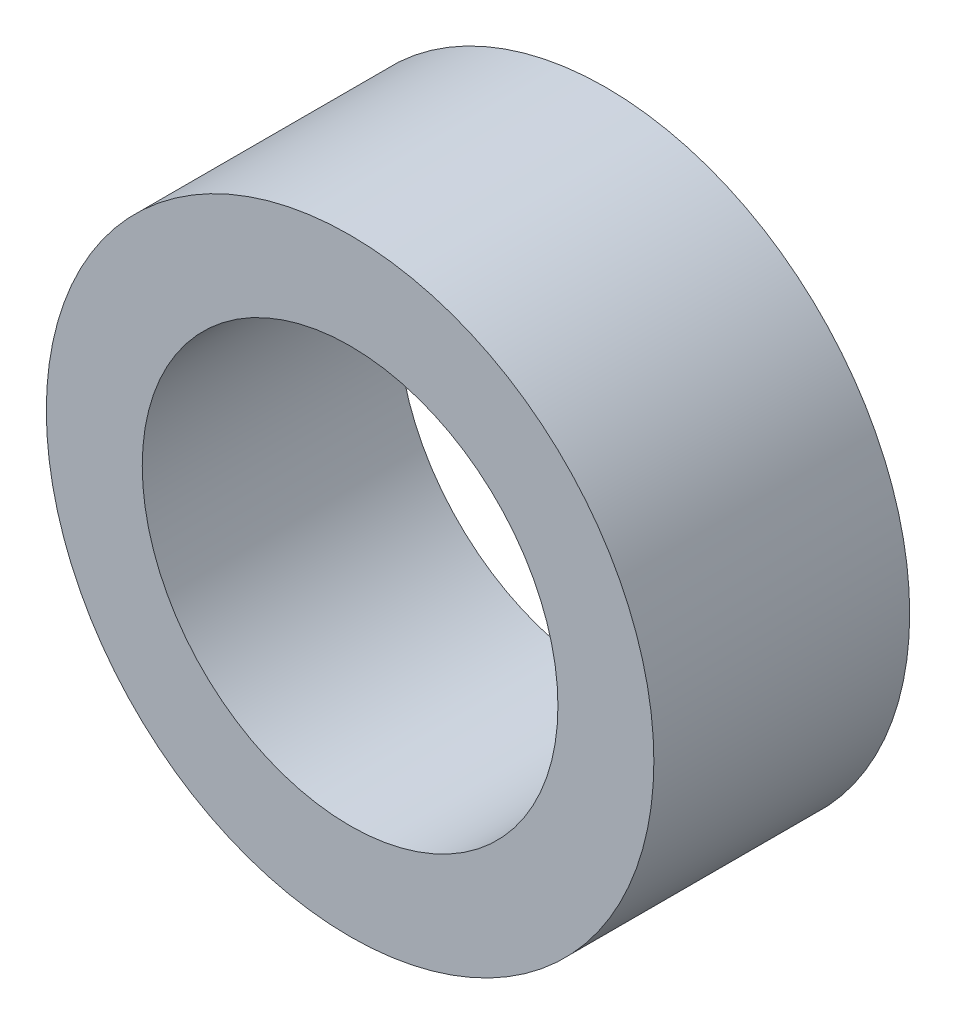
ISO-10303-21;
HEADER;
FILE_DESCRIPTION(('STEP AP214'),'2;1');
FILE_NAME('part.step','',(''),(''),'','','');
FILE_SCHEMA(('AUTOMOTIVE_DESIGN { 1 0 10303 214 1 1 1 1 }'));
ENDSEC;
DATA;
#1=APPLICATION_CONTEXT('core data for automotive mechanical design processes');
#2=APPLICATION_PROTOCOL_DEFINITION('international standard','automotive_design',2000,#1);
#3=PRODUCT_CONTEXT('',#1,'mechanical');
#4=PRODUCT('Part','Part','',(#3));
#5=PRODUCT_RELATED_PRODUCT_CATEGORY('part','',(#4));
#6=PRODUCT_DEFINITION_FORMATION('','',#4);
#7=PRODUCT_DEFINITION_CONTEXT('part definition',#1,'design');
#8=PRODUCT_DEFINITION('design','',#6,#7);
#9=PRODUCT_DEFINITION_SHAPE('','',#8);
#10=(LENGTH_UNIT() NAMED_UNIT(*) SI_UNIT(.MILLI.,.METRE.));
#11=(NAMED_UNIT(*) PLANE_ANGLE_UNIT() SI_UNIT($,.RADIAN.));
#12=(NAMED_UNIT(*) SI_UNIT($,.STERADIAN.) SOLID_ANGLE_UNIT());
#13=UNCERTAINTY_MEASURE_WITH_UNIT(LENGTH_MEASURE(1.E-05),#10,'distance_accuracy_value','');
#14=(GEOMETRIC_REPRESENTATION_CONTEXT(3) GLOBAL_UNCERTAINTY_ASSIGNED_CONTEXT((#13)) GLOBAL_UNIT_ASSIGNED_CONTEXT((#10,
#11,#12)) REPRESENTATION_CONTEXT('',''));
#15=CARTESIAN_POINT('',(0.,0.,0.));
#16=DIRECTION('',(0.,0.,1.));
#17=DIRECTION('',(1.,0.,0.));
#18=AXIS2_PLACEMENT_3D('',#15,#16,#17);
#19=CARTESIAN_POINT('',(0.,0.,4.));
#20=DIRECTION('',(0.,0.,1.));
#21=DIRECTION('',(1.,0.,0.));
#22=AXIS2_PLACEMENT_3D('',#19,#20,#21);
#23=PLANE('',#22);
#24=CARTESIAN_POINT('',(0.,0.,4.));
#25=DIRECTION('',(0.,0.,1.));
#26=DIRECTION('',(1.,0.,0.));
#27=AXIS2_PLACEMENT_3D('',#24,#25,#26);
#28=CIRCLE('',#27,4.75);
#29=CARTESIAN_POINT('',(4.75,0.,4.));
#30=VERTEX_POINT('',#29);
#31=EDGE_CURVE('E10',#30,#30,#28,.T.);
#32=ORIENTED_EDGE('',*,*,#31,.T.);
#33=EDGE_LOOP('',(#32));
#34=FACE_BOUND('',#33,.T.);
#35=CARTESIAN_POINT('',(0.,0.,4.));
#36=DIRECTION('',(0.,0.,1.));
#37=DIRECTION('',(1.,0.,0.));
#38=AXIS2_PLACEMENT_3D('',#35,#36,#37);
#39=CIRCLE('',#38,3.25);
#40=CARTESIAN_POINT('',(3.25,0.,4.));
#41=VERTEX_POINT('',#40);
#42=EDGE_CURVE('E50',#41,#41,#39,.T.);
#43=ORIENTED_EDGE('',*,*,#42,.F.);
#44=EDGE_LOOP('',(#43));
#45=FACE_BOUND('',#44,.T.);
#46=ADVANCED_FACE('F37',(#34,#45),#23,.T.);
#47=CARTESIAN_POINT('',(0.,0.,0.));
#48=DIRECTION('',(0.,0.,1.));
#49=DIRECTION('',(1.,0.,0.));
#50=AXIS2_PLACEMENT_3D('',#47,#48,#49);
#51=PLANE('',#50);
#52=CARTESIAN_POINT('',(0.,0.,0.));
#53=DIRECTION('',(0.,0.,1.));
#54=DIRECTION('',(1.,0.,0.));
#55=AXIS2_PLACEMENT_3D('',#52,#53,#54);
#56=CIRCLE('',#55,4.75);
#57=CARTESIAN_POINT('',(4.75,0.,0.));
#58=VERTEX_POINT('',#57);
#59=EDGE_CURVE('E41',#58,#58,#56,.T.);
#60=ORIENTED_EDGE('',*,*,#59,.F.);
#61=EDGE_LOOP('',(#60));
#62=FACE_BOUND('',#61,.T.);
#63=CARTESIAN_POINT('',(0.,0.,0.));
#64=DIRECTION('',(0.,0.,1.));
#65=DIRECTION('',(1.,0.,0.));
#66=AXIS2_PLACEMENT_3D('',#63,#64,#65);
#67=CIRCLE('',#66,3.25);
#68=CARTESIAN_POINT('',(3.25,0.,0.));
#69=VERTEX_POINT('',#68);
#70=EDGE_CURVE('E52',#69,#69,#67,.T.);
#71=ORIENTED_EDGE('',*,*,#70,.T.);
#72=EDGE_LOOP('',(#71));
#73=FACE_BOUND('',#72,.T.);
#74=ADVANCED_FACE('F64',(#62,#73),#51,.F.);
#75=CARTESIAN_POINT('',(0.,0.,4.));
#76=DIRECTION('',(0.,0.,-1.));
#77=DIRECTION('',(-1.,0.,0.));
#78=AXIS2_PLACEMENT_3D('',#75,#76,#77);
#79=CYLINDRICAL_SURFACE('',#78,4.75);
#80=ORIENTED_EDGE('',*,*,#31,.F.);
#81=EDGE_LOOP('',(#80));
#82=FACE_BOUND('',#81,.T.);
#83=ORIENTED_EDGE('',*,*,#59,.T.);
#84=EDGE_LOOP('',(#83));
#85=FACE_BOUND('',#84,.T.);
#86=ADVANCED_FACE('F39',(#82,#85),#79,.T.);
#87=CARTESIAN_POINT('',(0.,0.,4.));
#88=DIRECTION('',(0.,0.,-1.));
#89=DIRECTION('',(-1.,0.,0.));
#90=AXIS2_PLACEMENT_3D('',#87,#88,#89);
#91=CYLINDRICAL_SURFACE('',#90,3.25);
#92=ORIENTED_EDGE('',*,*,#42,.T.);
#93=EDGE_LOOP('',(#92));
#94=FACE_BOUND('',#93,.T.);
#95=ORIENTED_EDGE('',*,*,#70,.F.);
#96=EDGE_LOOP('',(#95));
#97=FACE_BOUND('',#96,.T.);
#98=ADVANCED_FACE('F60',(#94,#97),#91,.F.);
#99=CLOSED_SHELL('',(#46,#74,#86,#98));
#100=MANIFOLD_SOLID_BREP('B2',#99);
#101=ADVANCED_BREP_SHAPE_REPRESENTATION('',(#18,#100),#14);
#102=SHAPE_DEFINITION_REPRESENTATION(#9,#101);
ENDSEC;
END-ISO-10303-21;
